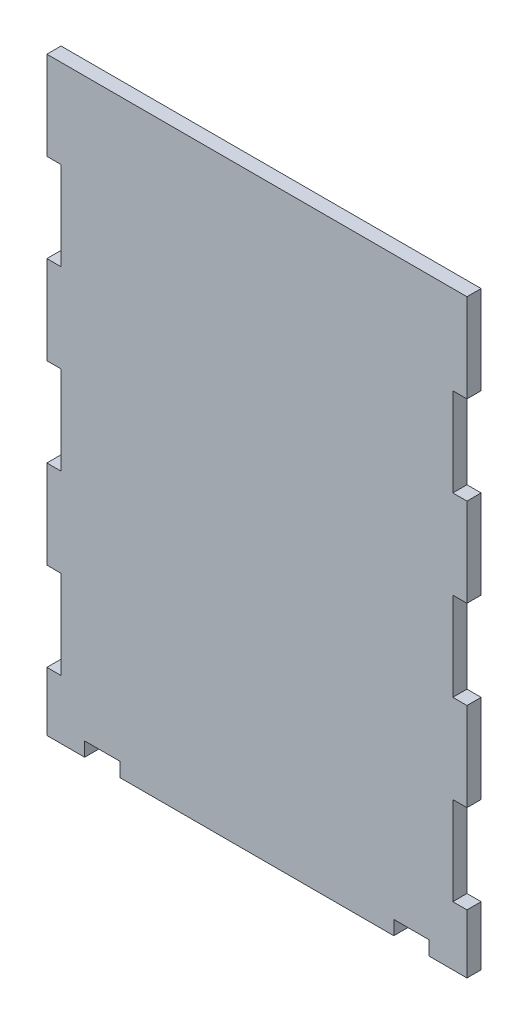
ISO-10303-21;
HEADER;
FILE_DESCRIPTION(('STEP AP214'),'2;1');
FILE_NAME('part.step','',(''),(''),'','','');
FILE_SCHEMA(('AUTOMOTIVE_DESIGN { 1 0 10303 214 1 1 1 1 }'));
ENDSEC;
DATA;
#1=APPLICATION_CONTEXT('core data for automotive mechanical design processes');
#2=APPLICATION_PROTOCOL_DEFINITION('international standard','automotive_design',2000,#1);
#3=PRODUCT_CONTEXT('',#1,'mechanical');
#4=PRODUCT('Part','Part','',(#3));
#5=PRODUCT_RELATED_PRODUCT_CATEGORY('part','',(#4));
#6=PRODUCT_DEFINITION_FORMATION('','',#4);
#7=PRODUCT_DEFINITION_CONTEXT('part definition',#1,'design');
#8=PRODUCT_DEFINITION('design','',#6,#7);
#9=PRODUCT_DEFINITION_SHAPE('','',#8);
#10=(LENGTH_UNIT() NAMED_UNIT(*) SI_UNIT(.MILLI.,.METRE.));
#11=(NAMED_UNIT(*) PLANE_ANGLE_UNIT() SI_UNIT($,.RADIAN.));
#12=(NAMED_UNIT(*) SI_UNIT($,.STERADIAN.) SOLID_ANGLE_UNIT());
#13=UNCERTAINTY_MEASURE_WITH_UNIT(LENGTH_MEASURE(1.E-05),#10,'distance_accuracy_value','');
#14=(GEOMETRIC_REPRESENTATION_CONTEXT(3) GLOBAL_UNCERTAINTY_ASSIGNED_CONTEXT((#13)) GLOBAL_UNIT_ASSIGNED_CONTEXT((#10,
#11,#12)) REPRESENTATION_CONTEXT('',''));
#15=CARTESIAN_POINT('',(0.,0.,0.));
#16=DIRECTION('',(0.,0.,1.));
#17=DIRECTION('',(1.,0.,0.));
#18=AXIS2_PLACEMENT_3D('',#15,#16,#17);
#19=CARTESIAN_POINT('',(0.,0.,6.));
#20=DIRECTION('',(0.,1.,0.));
#21=DIRECTION('',(-1.,0.,0.));
#22=AXIS2_PLACEMENT_3D('',#19,#20,#21);
#23=PLANE('',#22);
#24=DIRECTION('',(1.,0.,0.));
#25=VECTOR('',#24,1.);
#26=CARTESIAN_POINT('',(0.,0.,6.));
#27=LINE('',#26,#25);
#28=CARTESIAN_POINT('',(-16.,0.,6.));
#29=VERTEX_POINT('',#28);
#30=CARTESIAN_POINT('',(0.,0.,6.));
#31=VERTEX_POINT('',#30);
#32=EDGE_CURVE('E589',#29,#31,#27,.T.);
#33=ORIENTED_EDGE('',*,*,#32,.F.);
#34=DIRECTION('',(0.,0.,1.));
#35=VECTOR('',#34,1.);
#36=CARTESIAN_POINT('',(-16.,0.,0.));
#37=LINE('',#36,#35);
#38=CARTESIAN_POINT('',(-16.,0.,0.));
#39=VERTEX_POINT('',#38);
#40=EDGE_CURVE('E316',#39,#29,#37,.T.);
#41=ORIENTED_EDGE('',*,*,#40,.F.);
#42=DIRECTION('',(1.,0.,0.));
#43=VECTOR('',#42,1.);
#44=CARTESIAN_POINT('',(0.,0.,0.));
#45=LINE('',#44,#43);
#46=CARTESIAN_POINT('',(0.,0.,0.));
#47=VERTEX_POINT('',#46);
#48=EDGE_CURVE('E301',#39,#47,#45,.T.);
#49=ORIENTED_EDGE('',*,*,#48,.T.);
#50=DIRECTION('',(0.,0.,-1.));
#51=VECTOR('',#50,1.);
#52=CARTESIAN_POINT('',(0.,0.,6.));
#53=LINE('',#52,#51);
#54=EDGE_CURVE('E595',#31,#47,#53,.T.);
#55=ORIENTED_EDGE('',*,*,#54,.F.);
#56=EDGE_LOOP('',(#33,#41,#49,#55));
#57=FACE_BOUND('',#56,.T.);
#58=ADVANCED_FACE('F45',(#57),#23,.F.);
#59=CARTESIAN_POINT('',(-178.,0.,0.));
#60=VERTEX_POINT('',#59);
#61=CARTESIAN_POINT('',(-162.,0.,0.));
#62=VERTEX_POINT('',#61);
#63=EDGE_CURVE('E611',#60,#62,#45,.T.);
#64=ORIENTED_EDGE('',*,*,#63,.T.);
#65=DIRECTION('',(0.,0.,1.));
#66=VECTOR('',#65,1.);
#67=CARTESIAN_POINT('',(-162.,0.,0.));
#68=LINE('',#67,#66);
#69=CARTESIAN_POINT('',(-162.,0.,6.));
#70=VERTEX_POINT('',#69);
#71=EDGE_CURVE('E336',#62,#70,#68,.T.);
#72=ORIENTED_EDGE('',*,*,#71,.T.);
#73=CARTESIAN_POINT('',(-178.,0.,6.));
#74=VERTEX_POINT('',#73);
#75=EDGE_CURVE('E591',#74,#70,#27,.T.);
#76=ORIENTED_EDGE('',*,*,#75,.F.);
#77=DIRECTION('',(0.,0.,-1.));
#78=VECTOR('',#77,1.);
#79=CARTESIAN_POINT('',(-178.,0.,6.));
#80=LINE('',#79,#78);
#81=EDGE_CURVE('E619',#74,#60,#80,.T.);
#82=ORIENTED_EDGE('',*,*,#81,.T.);
#83=EDGE_LOOP('',(#64,#72,#76,#82));
#84=FACE_BOUND('',#83,.T.);
#85=ADVANCED_FACE('F696',(#84),#23,.F.);
#86=CARTESIAN_POINT('',(0.,0.,6.));
#87=DIRECTION('',(-1.,0.,0.));
#88=DIRECTION('',(0.,0.,1.));
#89=AXIS2_PLACEMENT_3D('',#86,#87,#88);
#90=PLANE('',#89);
#91=DIRECTION('',(0.,1.,0.));
#92=VECTOR('',#91,1.);
#93=CARTESIAN_POINT('',(0.,0.,6.));
#94=LINE('',#93,#92);
#95=CARTESIAN_POINT('',(0.,212.5,6.));
#96=VERTEX_POINT('',#95);
#97=CARTESIAN_POINT('',(0.,250.,6.));
#98=VERTEX_POINT('',#97);
#99=EDGE_CURVE('E581',#96,#98,#94,.T.);
#100=ORIENTED_EDGE('',*,*,#99,.F.);
#101=DIRECTION('',(0.,0.,1.));
#102=VECTOR('',#101,1.);
#103=CARTESIAN_POINT('',(0.,212.5,0.));
#104=LINE('',#103,#102);
#105=CARTESIAN_POINT('',(0.,212.5,0.));
#106=VERTEX_POINT('',#105);
#107=EDGE_CURVE('E388',#106,#96,#104,.T.);
#108=ORIENTED_EDGE('',*,*,#107,.F.);
#109=DIRECTION('',(0.,1.,0.));
#110=VECTOR('',#109,1.);
#111=CARTESIAN_POINT('',(0.,0.,0.));
#112=LINE('',#111,#110);
#113=CARTESIAN_POINT('',(0.,250.,0.));
#114=VERTEX_POINT('',#113);
#115=EDGE_CURVE('E566',#106,#114,#112,.T.);
#116=ORIENTED_EDGE('',*,*,#115,.T.);
#117=DIRECTION('',(0.,0.,-1.));
#118=VECTOR('',#117,1.);
#119=CARTESIAN_POINT('',(0.,250.,6.));
#120=LINE('',#119,#118);
#121=EDGE_CURVE('E11',#98,#114,#120,.T.);
#122=ORIENTED_EDGE('',*,*,#121,.F.);
#123=EDGE_LOOP('',(#100,#108,#116,#122));
#124=FACE_BOUND('',#123,.T.);
#125=ADVANCED_FACE('F645',(#124),#90,.F.);
#126=CARTESIAN_POINT('',(0.,137.5,0.));
#127=VERTEX_POINT('',#126);
#128=CARTESIAN_POINT('',(0.,175.,0.));
#129=VERTEX_POINT('',#128);
#130=EDGE_CURVE('E648',#127,#129,#112,.T.);
#131=ORIENTED_EDGE('',*,*,#130,.T.);
#132=DIRECTION('',(0.,0.,1.));
#133=VECTOR('',#132,1.);
#134=CARTESIAN_POINT('',(0.,175.,0.));
#135=LINE('',#134,#133);
#136=CARTESIAN_POINT('',(0.,175.,6.));
#137=VERTEX_POINT('',#136);
#138=EDGE_CURVE('E391',#129,#137,#135,.T.);
#139=ORIENTED_EDGE('',*,*,#138,.T.);
#140=CARTESIAN_POINT('',(0.,137.5,6.));
#141=VERTEX_POINT('',#140);
#142=EDGE_CURVE('E672',#141,#137,#94,.T.);
#143=ORIENTED_EDGE('',*,*,#142,.F.);
#144=DIRECTION('',(0.,0.,1.));
#145=VECTOR('',#144,1.);
#146=CARTESIAN_POINT('',(0.,137.5,0.));
#147=LINE('',#146,#145);
#148=EDGE_CURVE('E460',#127,#141,#147,.T.);
#149=ORIENTED_EDGE('',*,*,#148,.F.);
#150=EDGE_LOOP('',(#131,#139,#143,#149));
#151=FACE_BOUND('',#150,.T.);
#152=ADVANCED_FACE('F1032',(#151),#90,.F.);
#153=CARTESIAN_POINT('',(0.,62.5,0.));
#154=VERTEX_POINT('',#153);
#155=CARTESIAN_POINT('',(0.,100.,0.));
#156=VERTEX_POINT('',#155);
#157=EDGE_CURVE('E602',#154,#156,#112,.T.);
#158=ORIENTED_EDGE('',*,*,#157,.T.);
#159=DIRECTION('',(0.,0.,1.));
#160=VECTOR('',#159,1.);
#161=CARTESIAN_POINT('',(0.,100.,0.));
#162=LINE('',#161,#160);
#163=CARTESIAN_POINT('',(0.,100.,6.));
#164=VERTEX_POINT('',#163);
#165=EDGE_CURVE('E463',#156,#164,#162,.T.);
#166=ORIENTED_EDGE('',*,*,#165,.T.);
#167=CARTESIAN_POINT('',(0.,62.5,6.));
#168=VERTEX_POINT('',#167);
#169=EDGE_CURVE('E580',#168,#164,#94,.T.);
#170=ORIENTED_EDGE('',*,*,#169,.F.);
#171=DIRECTION('',(0.,0.,1.));
#172=VECTOR('',#171,1.);
#173=CARTESIAN_POINT('',(0.,62.5,0.));
#174=LINE('',#173,#172);
#175=EDGE_CURVE('E530',#154,#168,#174,.T.);
#176=ORIENTED_EDGE('',*,*,#175,.F.);
#177=EDGE_LOOP('',(#158,#166,#170,#176));
#178=FACE_BOUND('',#177,.T.);
#179=ADVANCED_FACE('F659',(#178),#90,.F.);
#180=CARTESIAN_POINT('',(-178.,0.,6.));
#181=DIRECTION('',(1.,0.,0.));
#182=DIRECTION('',(0.,0.,-1.));
#183=AXIS2_PLACEMENT_3D('',#180,#181,#182);
#184=PLANE('',#183);
#185=DIRECTION('',(0.,-1.,0.));
#186=VECTOR('',#185,1.);
#187=CARTESIAN_POINT('',(-178.,0.,0.));
#188=LINE('',#187,#186);
#189=CARTESIAN_POINT('',(-178.,175.,0.));
#190=VERTEX_POINT('',#189);
#191=CARTESIAN_POINT('',(-178.,137.5,0.));
#192=VERTEX_POINT('',#191);
#193=EDGE_CURVE('E610',#190,#192,#188,.T.);
#194=ORIENTED_EDGE('',*,*,#193,.T.);
#195=DIRECTION('',(0.,0.,1.));
#196=VECTOR('',#195,1.);
#197=CARTESIAN_POINT('',(-178.,137.5,0.));
#198=LINE('',#197,#196);
#199=CARTESIAN_POINT('',(-178.,137.5,6.));
#200=VERTEX_POINT('',#199);
#201=EDGE_CURVE('E378',#192,#200,#198,.T.);
#202=ORIENTED_EDGE('',*,*,#201,.T.);
#203=DIRECTION('',(0.,-1.,0.));
#204=VECTOR('',#203,1.);
#205=CARTESIAN_POINT('',(-178.,0.,6.));
#206=LINE('',#205,#204);
#207=CARTESIAN_POINT('',(-178.,175.,6.));
#208=VERTEX_POINT('',#207);
#209=EDGE_CURVE('E590',#208,#200,#206,.T.);
#210=ORIENTED_EDGE('',*,*,#209,.F.);
#211=DIRECTION('',(0.,0.,1.));
#212=VECTOR('',#211,1.);
#213=CARTESIAN_POINT('',(-178.,175.,0.));
#214=LINE('',#213,#212);
#215=EDGE_CURVE('E552',#190,#208,#214,.T.);
#216=ORIENTED_EDGE('',*,*,#215,.F.);
#217=EDGE_LOOP('',(#194,#202,#210,#216));
#218=FACE_BOUND('',#217,.T.);
#219=ADVANCED_FACE('F719',(#218),#184,.F.);
#220=CARTESIAN_POINT('',(-178.,100.,6.));
#221=VERTEX_POINT('',#220);
#222=CARTESIAN_POINT('',(-178.,62.5,6.));
#223=VERTEX_POINT('',#222);
#224=EDGE_CURVE('E705',#221,#223,#206,.T.);
#225=ORIENTED_EDGE('',*,*,#224,.F.);
#226=DIRECTION('',(0.,0.,1.));
#227=VECTOR('',#226,1.);
#228=CARTESIAN_POINT('',(-178.,100.,0.));
#229=LINE('',#228,#227);
#230=CARTESIAN_POINT('',(-178.,100.,0.));
#231=VERTEX_POINT('',#230);
#232=EDGE_CURVE('E410',#231,#221,#229,.T.);
#233=ORIENTED_EDGE('',*,*,#232,.F.);
#234=CARTESIAN_POINT('',(-178.,62.5,0.));
#235=VERTEX_POINT('',#234);
#236=EDGE_CURVE('E684',#231,#235,#188,.T.);
#237=ORIENTED_EDGE('',*,*,#236,.T.);
#238=DIRECTION('',(0.,0.,1.));
#239=VECTOR('',#238,1.);
#240=CARTESIAN_POINT('',(-178.,62.5,0.));
#241=LINE('',#240,#239);
#242=EDGE_CURVE('E452',#235,#223,#241,.T.);
#243=ORIENTED_EDGE('',*,*,#242,.T.);
#244=EDGE_LOOP('',(#225,#233,#237,#243));
#245=FACE_BOUND('',#244,.T.);
#246=ADVANCED_FACE('F732',(#245),#184,.F.);
#247=CARTESIAN_POINT('',(-178.,250.,0.));
#248=VERTEX_POINT('',#247);
#249=CARTESIAN_POINT('',(-178.,212.5,0.));
#250=VERTEX_POINT('',#249);
#251=EDGE_CURVE('E606',#248,#250,#188,.T.);
#252=ORIENTED_EDGE('',*,*,#251,.T.);
#253=DIRECTION('',(0.,0.,1.));
#254=VECTOR('',#253,1.);
#255=CARTESIAN_POINT('',(-178.,212.5,0.));
#256=LINE('',#255,#254);
#257=CARTESIAN_POINT('',(-178.,212.5,6.));
#258=VERTEX_POINT('',#257);
#259=EDGE_CURVE('E562',#250,#258,#256,.T.);
#260=ORIENTED_EDGE('',*,*,#259,.T.);
#261=CARTESIAN_POINT('',(-178.,250.,6.));
#262=VERTEX_POINT('',#261);
#263=EDGE_CURVE('E585',#262,#258,#206,.T.);
#264=ORIENTED_EDGE('',*,*,#263,.F.);
#265=DIRECTION('',(0.,0.,-1.));
#266=VECTOR('',#265,1.);
#267=CARTESIAN_POINT('',(-178.,250.,6.));
#268=LINE('',#267,#266);
#269=EDGE_CURVE('E54',#262,#248,#268,.T.);
#270=ORIENTED_EDGE('',*,*,#269,.T.);
#271=EDGE_LOOP('',(#252,#260,#264,#270));
#272=FACE_BOUND('',#271,.T.);
#273=ADVANCED_FACE('F628',(#272),#184,.F.);
#274=CARTESIAN_POINT('',(0.,25.,0.));
#275=VERTEX_POINT('',#274);
#276=EDGE_CURVE('E597',#47,#275,#112,.T.);
#277=ORIENTED_EDGE('',*,*,#276,.T.);
#278=DIRECTION('',(0.,0.,1.));
#279=VECTOR('',#278,1.);
#280=CARTESIAN_POINT('',(0.,25.,0.));
#281=LINE('',#280,#279);
#282=CARTESIAN_POINT('',(0.,25.,6.));
#283=VERTEX_POINT('',#282);
#284=EDGE_CURVE('E533',#275,#283,#281,.T.);
#285=ORIENTED_EDGE('',*,*,#284,.T.);
#286=EDGE_CURVE('E575',#31,#283,#94,.T.);
#287=ORIENTED_EDGE('',*,*,#286,.F.);
#288=ORIENTED_EDGE('',*,*,#54,.T.);
#289=EDGE_LOOP('',(#277,#285,#287,#288));
#290=FACE_BOUND('',#289,.T.);
#291=ADVANCED_FACE('F47',(#290),#90,.F.);
#292=CARTESIAN_POINT('',(0.,250.,6.));
#293=DIRECTION('',(0.,-1.,0.));
#294=DIRECTION('',(1.,0.,0.));
#295=AXIS2_PLACEMENT_3D('',#292,#293,#294);
#296=PLANE('',#295);
#297=DIRECTION('',(-1.,0.,0.));
#298=VECTOR('',#297,1.);
#299=CARTESIAN_POINT('',(0.,250.,0.));
#300=LINE('',#299,#298);
#301=EDGE_CURVE('E601',#114,#248,#300,.T.);
#302=ORIENTED_EDGE('',*,*,#301,.T.);
#303=ORIENTED_EDGE('',*,*,#269,.F.);
#304=DIRECTION('',(-1.,0.,0.));
#305=VECTOR('',#304,1.);
#306=CARTESIAN_POINT('',(0.,250.,6.));
#307=LINE('',#306,#305);
#308=EDGE_CURVE('E579',#98,#262,#307,.T.);
#309=ORIENTED_EDGE('',*,*,#308,.F.);
#310=ORIENTED_EDGE('',*,*,#121,.T.);
#311=EDGE_LOOP('',(#302,#303,#309,#310));
#312=FACE_BOUND('',#311,.T.);
#313=ADVANCED_FACE('F643',(#312),#296,.F.);
#314=CARTESIAN_POINT('',(-178.,25.,6.));
#315=VERTEX_POINT('',#314);
#316=EDGE_CURVE('E584',#315,#74,#206,.T.);
#317=ORIENTED_EDGE('',*,*,#316,.F.);
#318=DIRECTION('',(0.,0.,1.));
#319=VECTOR('',#318,1.);
#320=CARTESIAN_POINT('',(-178.,25.,0.));
#321=LINE('',#320,#319);
#322=CARTESIAN_POINT('',(-178.,25.,0.));
#323=VERTEX_POINT('',#322);
#324=EDGE_CURVE('E482',#323,#315,#321,.T.);
#325=ORIENTED_EDGE('',*,*,#324,.F.);
#326=EDGE_CURVE('E605',#323,#60,#188,.T.);
#327=ORIENTED_EDGE('',*,*,#326,.T.);
#328=ORIENTED_EDGE('',*,*,#81,.F.);
#329=EDGE_LOOP('',(#317,#325,#327,#328));
#330=FACE_BOUND('',#329,.T.);
#331=ADVANCED_FACE('F692',(#330),#184,.F.);
#332=CARTESIAN_POINT('',(-147.,0.,0.));
#333=VERTEX_POINT('',#332);
#334=CARTESIAN_POINT('',(-31.,0.,0.));
#335=VERTEX_POINT('',#334);
#336=EDGE_CURVE('E615',#333,#335,#45,.T.);
#337=ORIENTED_EDGE('',*,*,#336,.T.);
#338=DIRECTION('',(0.,0.,1.));
#339=VECTOR('',#338,1.);
#340=CARTESIAN_POINT('',(-31.,0.,0.));
#341=LINE('',#340,#339);
#342=CARTESIAN_POINT('',(-31.,0.,6.));
#343=VERTEX_POINT('',#342);
#344=EDGE_CURVE('E320',#335,#343,#341,.T.);
#345=ORIENTED_EDGE('',*,*,#344,.T.);
#346=CARTESIAN_POINT('',(-147.,0.,6.));
#347=VERTEX_POINT('',#346);
#348=EDGE_CURVE('E596',#347,#343,#27,.T.);
#349=ORIENTED_EDGE('',*,*,#348,.F.);
#350=DIRECTION('',(0.,0.,1.));
#351=VECTOR('',#350,1.);
#352=CARTESIAN_POINT('',(-147.,0.,0.));
#353=LINE('',#352,#351);
#354=EDGE_CURVE('E326',#333,#347,#353,.T.);
#355=ORIENTED_EDGE('',*,*,#354,.F.);
#356=EDGE_LOOP('',(#337,#345,#349,#355));
#357=FACE_BOUND('',#356,.T.);
#358=ADVANCED_FACE('F756',(#357),#23,.F.);
#359=CARTESIAN_POINT('',(0.,0.,6.));
#360=DIRECTION('',(0.,0.,1.));
#361=DIRECTION('',(1.,0.,0.));
#362=AXIS2_PLACEMENT_3D('',#359,#360,#361);
#363=PLANE('',#362);
#364=DIRECTION('',(0.,1.,0.));
#365=VECTOR('',#364,1.);
#366=CARTESIAN_POINT('',(-16.,0.,6.));
#367=LINE('',#366,#365);
#368=CARTESIAN_POINT('',(-16.,6.,6.));
#369=VERTEX_POINT('',#368);
#370=EDGE_CURVE('E285',#29,#369,#367,.T.);
#371=ORIENTED_EDGE('',*,*,#370,.F.);
#372=ORIENTED_EDGE('',*,*,#32,.T.);
#373=ORIENTED_EDGE('',*,*,#286,.T.);
#374=DIRECTION('',(1.,0.,0.));
#375=VECTOR('',#374,1.);
#376=CARTESIAN_POINT('',(-6.00000000000001,25.,6.));
#377=LINE('',#376,#375);
#378=CARTESIAN_POINT('',(-6.00000000000001,25.,6.));
#379=VERTEX_POINT('',#378);
#380=EDGE_CURVE('E522',#379,#283,#377,.T.);
#381=ORIENTED_EDGE('',*,*,#380,.F.);
#382=DIRECTION('',(0.,-1.,0.));
#383=VECTOR('',#382,1.);
#384=CARTESIAN_POINT('',(-6.00000000000001,62.5,6.));
#385=LINE('',#384,#383);
#386=CARTESIAN_POINT('',(-6.00000000000001,62.5,6.));
#387=VERTEX_POINT('',#386);
#388=EDGE_CURVE('E319',#387,#379,#385,.T.);
#389=ORIENTED_EDGE('',*,*,#388,.F.);
#390=DIRECTION('',(-1.,0.,0.));
#391=VECTOR('',#390,1.);
#392=CARTESIAN_POINT('',(-6.00000000000001,62.5,6.));
#393=LINE('',#392,#391);
#394=EDGE_CURVE('E510',#168,#387,#393,.T.);
#395=ORIENTED_EDGE('',*,*,#394,.F.);
#396=ORIENTED_EDGE('',*,*,#169,.T.);
#397=DIRECTION('',(1.,0.,0.));
#398=VECTOR('',#397,1.);
#399=CARTESIAN_POINT('',(-6.00000000000001,100.,6.));
#400=LINE('',#399,#398);
#401=CARTESIAN_POINT('',(-6.00000000000001,100.,6.));
#402=VERTEX_POINT('',#401);
#403=EDGE_CURVE('E451',#402,#164,#400,.T.);
#404=ORIENTED_EDGE('',*,*,#403,.F.);
#405=DIRECTION('',(0.,-1.,0.));
#406=VECTOR('',#405,1.);
#407=CARTESIAN_POINT('',(-6.00000000000001,137.5,6.));
#408=LINE('',#407,#406);
#409=CARTESIAN_POINT('',(-6.00000000000001,137.5,6.));
#410=VERTEX_POINT('',#409);
#411=EDGE_CURVE('E447',#410,#402,#408,.T.);
#412=ORIENTED_EDGE('',*,*,#411,.F.);
#413=DIRECTION('',(-1.,0.,0.));
#414=VECTOR('',#413,1.);
#415=CARTESIAN_POINT('',(-6.00000000000001,137.5,6.));
#416=LINE('',#415,#414);
#417=EDGE_CURVE('E438',#141,#410,#416,.T.);
#418=ORIENTED_EDGE('',*,*,#417,.F.);
#419=ORIENTED_EDGE('',*,*,#142,.T.);
#420=DIRECTION('',(1.,0.,0.));
#421=VECTOR('',#420,1.);
#422=CARTESIAN_POINT('',(-6.00000000000001,175.,6.));
#423=LINE('',#422,#421);
#424=CARTESIAN_POINT('',(-6.00000000000001,175.,6.));
#425=VERTEX_POINT('',#424);
#426=EDGE_CURVE('E377',#425,#137,#423,.T.);
#427=ORIENTED_EDGE('',*,*,#426,.F.);
#428=DIRECTION('',(0.,-1.,0.));
#429=VECTOR('',#428,1.);
#430=CARTESIAN_POINT('',(-6.00000000000001,212.5,6.));
#431=LINE('',#430,#429);
#432=CARTESIAN_POINT('',(-6.00000000000001,212.5,6.));
#433=VERTEX_POINT('',#432);
#434=EDGE_CURVE('E373',#433,#425,#431,.T.);
#435=ORIENTED_EDGE('',*,*,#434,.F.);
#436=DIRECTION('',(-1.,0.,0.));
#437=VECTOR('',#436,1.);
#438=CARTESIAN_POINT('',(-6.00000000000001,212.5,6.));
#439=LINE('',#438,#437);
#440=EDGE_CURVE('E364',#96,#433,#439,.T.);
#441=ORIENTED_EDGE('',*,*,#440,.F.);
#442=ORIENTED_EDGE('',*,*,#99,.T.);
#443=ORIENTED_EDGE('',*,*,#308,.T.);
#444=ORIENTED_EDGE('',*,*,#263,.T.);
#445=DIRECTION('',(-1.,0.,0.));
#446=VECTOR('',#445,1.);
#447=CARTESIAN_POINT('',(-178.,212.5,6.));
#448=LINE('',#447,#446);
#449=CARTESIAN_POINT('',(-172.,212.5,6.));
#450=VERTEX_POINT('',#449);
#451=EDGE_CURVE('E544',#450,#258,#448,.T.);
#452=ORIENTED_EDGE('',*,*,#451,.F.);
#453=DIRECTION('',(0.,1.,0.));
#454=VECTOR('',#453,1.);
#455=CARTESIAN_POINT('',(-172.,212.5,6.));
#456=LINE('',#455,#454);
#457=CARTESIAN_POINT('',(-172.,175.,6.));
#458=VERTEX_POINT('',#457);
#459=EDGE_CURVE('E556',#458,#450,#456,.T.);
#460=ORIENTED_EDGE('',*,*,#459,.F.);
#461=DIRECTION('',(1.,0.,0.));
#462=VECTOR('',#461,1.);
#463=CARTESIAN_POINT('',(-178.,175.,6.));
#464=LINE('',#463,#462);
#465=EDGE_CURVE('E387',#208,#458,#464,.T.);
#466=ORIENTED_EDGE('',*,*,#465,.F.);
#467=ORIENTED_EDGE('',*,*,#209,.T.);
#468=DIRECTION('',(-1.,0.,0.));
#469=VECTOR('',#468,1.);
#470=CARTESIAN_POINT('',(-178.,137.5,6.));
#471=LINE('',#470,#469);
#472=CARTESIAN_POINT('',(-172.,137.5,6.));
#473=VERTEX_POINT('',#472);
#474=EDGE_CURVE('E402',#473,#200,#471,.T.);
#475=ORIENTED_EDGE('',*,*,#474,.F.);
#476=DIRECTION('',(0.,1.,0.));
#477=VECTOR('',#476,1.);
#478=CARTESIAN_POINT('',(-172.,137.5,6.));
#479=LINE('',#478,#477);
#480=CARTESIAN_POINT('',(-172.,100.,6.));
#481=VERTEX_POINT('',#480);
#482=EDGE_CURVE('E415',#481,#473,#479,.T.);
#483=ORIENTED_EDGE('',*,*,#482,.F.);
#484=DIRECTION('',(1.,0.,0.));
#485=VECTOR('',#484,1.);
#486=CARTESIAN_POINT('',(-178.,100.,6.));
#487=LINE('',#486,#485);
#488=EDGE_CURVE('E411',#221,#481,#487,.T.);
#489=ORIENTED_EDGE('',*,*,#488,.F.);
#490=ORIENTED_EDGE('',*,*,#224,.T.);
#491=DIRECTION('',(-1.,0.,0.));
#492=VECTOR('',#491,1.);
#493=CARTESIAN_POINT('',(-178.,62.5,6.));
#494=LINE('',#493,#492);
#495=CARTESIAN_POINT('',(-172.,62.5,6.));
#496=VERTEX_POINT('',#495);
#497=EDGE_CURVE('E474',#496,#223,#494,.T.);
#498=ORIENTED_EDGE('',*,*,#497,.F.);
#499=DIRECTION('',(0.,1.,0.));
#500=VECTOR('',#499,1.);
#501=CARTESIAN_POINT('',(-172.,62.5,6.));
#502=LINE('',#501,#500);
#503=CARTESIAN_POINT('',(-172.,25.,6.));
#504=VERTEX_POINT('',#503);
#505=EDGE_CURVE('E487',#504,#496,#502,.T.);
#506=ORIENTED_EDGE('',*,*,#505,.F.);
#507=DIRECTION('',(1.,0.,0.));
#508=VECTOR('',#507,1.);
#509=CARTESIAN_POINT('',(-178.,25.,6.));
#510=LINE('',#509,#508);
#511=EDGE_CURVE('E483',#315,#504,#510,.T.);
#512=ORIENTED_EDGE('',*,*,#511,.F.);
#513=ORIENTED_EDGE('',*,*,#316,.T.);
#514=ORIENTED_EDGE('',*,*,#75,.T.);
#515=DIRECTION('',(0.,-1.,0.));
#516=VECTOR('',#515,1.);
#517=CARTESIAN_POINT('',(-162.,0.,6.));
#518=LINE('',#517,#516);
#519=CARTESIAN_POINT('',(-162.,6.,6.));
#520=VERTEX_POINT('',#519);
#521=EDGE_CURVE('E340',#520,#70,#518,.T.);
#522=ORIENTED_EDGE('',*,*,#521,.F.);
#523=DIRECTION('',(-1.,0.,0.));
#524=VECTOR('',#523,1.);
#525=CARTESIAN_POINT('',(-162.,6.,6.));
#526=LINE('',#525,#524);
#527=CARTESIAN_POINT('',(-147.,5.99999999999998,6.));
#528=VERTEX_POINT('',#527);
#529=EDGE_CURVE('E343',#528,#520,#526,.T.);
#530=ORIENTED_EDGE('',*,*,#529,.F.);
#531=DIRECTION('',(0.,1.,0.));
#532=VECTOR('',#531,1.);
#533=CARTESIAN_POINT('',(-147.,0.,6.));
#534=LINE('',#533,#532);
#535=EDGE_CURVE('E313',#347,#528,#534,.T.);
#536=ORIENTED_EDGE('',*,*,#535,.F.);
#537=ORIENTED_EDGE('',*,*,#348,.T.);
#538=DIRECTION('',(0.,-1.,0.));
#539=VECTOR('',#538,1.);
#540=CARTESIAN_POINT('',(-31.,0.,6.));
#541=LINE('',#540,#539);
#542=CARTESIAN_POINT('',(-31.,6.,6.));
#543=VERTEX_POINT('',#542);
#544=EDGE_CURVE('E303',#543,#343,#541,.T.);
#545=ORIENTED_EDGE('',*,*,#544,.F.);
#546=DIRECTION('',(-1.,0.,0.));
#547=VECTOR('',#546,1.);
#548=CARTESIAN_POINT('',(-16.,6.,6.));
#549=LINE('',#548,#547);
#550=EDGE_CURVE('E306',#369,#543,#549,.T.);
#551=ORIENTED_EDGE('',*,*,#550,.F.);
#552=EDGE_LOOP('',(#371,#372,#373,#381,#389,#395,#396,#404,#412,#418,#419,#427,#435,#441,#442,
#443,#444,#452,#460,#466,#467,#475,#483,#489,#490,#498,#506,#512,#513,#514,#522,#530,#536,#537,
#545,#551));
#553=FACE_BOUND('',#552,.T.);
#554=ADVANCED_FACE('F638',(#553),#363,.T.);
#555=CARTESIAN_POINT('',(0.,0.,0.));
#556=DIRECTION('',(0.,0.,1.));
#557=DIRECTION('',(1.,0.,0.));
#558=AXIS2_PLACEMENT_3D('',#555,#556,#557);
#559=PLANE('',#558);
#560=ORIENTED_EDGE('',*,*,#48,.F.);
#561=DIRECTION('',(0.,1.,0.));
#562=VECTOR('',#561,1.);
#563=CARTESIAN_POINT('',(-16.,0.,0.));
#564=LINE('',#563,#562);
#565=CARTESIAN_POINT('',(-16.,6.,0.));
#566=VERTEX_POINT('',#565);
#567=EDGE_CURVE('E282',#39,#566,#564,.T.);
#568=ORIENTED_EDGE('',*,*,#567,.T.);
#569=DIRECTION('',(-1.,0.,0.));
#570=VECTOR('',#569,1.);
#571=CARTESIAN_POINT('',(-16.,6.,0.));
#572=LINE('',#571,#570);
#573=CARTESIAN_POINT('',(-31.,6.,0.));
#574=VERTEX_POINT('',#573);
#575=EDGE_CURVE('E293',#566,#574,#572,.T.);
#576=ORIENTED_EDGE('',*,*,#575,.T.);
#577=DIRECTION('',(0.,-1.,0.));
#578=VECTOR('',#577,1.);
#579=CARTESIAN_POINT('',(-31.,0.,0.));
#580=LINE('',#579,#578);
#581=EDGE_CURVE('E61',#574,#335,#580,.T.);
#582=ORIENTED_EDGE('',*,*,#581,.T.);
#583=ORIENTED_EDGE('',*,*,#336,.F.);
#584=DIRECTION('',(0.,1.,0.));
#585=VECTOR('',#584,1.);
#586=CARTESIAN_POINT('',(-147.,0.,0.));
#587=LINE('',#586,#585);
#588=CARTESIAN_POINT('',(-147.,5.99999999999998,0.));
#589=VERTEX_POINT('',#588);
#590=EDGE_CURVE('E344',#333,#589,#587,.T.);
#591=ORIENTED_EDGE('',*,*,#590,.T.);
#592=DIRECTION('',(-1.,0.,0.));
#593=VECTOR('',#592,1.);
#594=CARTESIAN_POINT('',(-162.,6.,0.));
#595=LINE('',#594,#593);
#596=CARTESIAN_POINT('',(-162.,6.,0.));
#597=VERTEX_POINT('',#596);
#598=EDGE_CURVE('E69',#589,#597,#595,.T.);
#599=ORIENTED_EDGE('',*,*,#598,.T.);
#600=DIRECTION('',(0.,-1.,0.));
#601=VECTOR('',#600,1.);
#602=CARTESIAN_POINT('',(-162.,0.,0.));
#603=LINE('',#602,#601);
#604=EDGE_CURVE('E329',#597,#62,#603,.T.);
#605=ORIENTED_EDGE('',*,*,#604,.T.);
#606=ORIENTED_EDGE('',*,*,#63,.F.);
#607=ORIENTED_EDGE('',*,*,#326,.F.);
#608=DIRECTION('',(1.,0.,0.));
#609=VECTOR('',#608,1.);
#610=CARTESIAN_POINT('',(-178.,25.,0.));
#611=LINE('',#610,#609);
#612=CARTESIAN_POINT('',(-172.,25.,0.));
#613=VERTEX_POINT('',#612);
#614=EDGE_CURVE('E469',#323,#613,#611,.T.);
#615=ORIENTED_EDGE('',*,*,#614,.T.);
#616=DIRECTION('',(0.,1.,0.));
#617=VECTOR('',#616,1.);
#618=CARTESIAN_POINT('',(-172.,62.5,0.));
#619=LINE('',#618,#617);
#620=CARTESIAN_POINT('',(-172.,62.5,0.));
#621=VERTEX_POINT('',#620);
#622=EDGE_CURVE('E473',#613,#621,#619,.T.);
#623=ORIENTED_EDGE('',*,*,#622,.T.);
#624=DIRECTION('',(-1.,0.,0.));
#625=VECTOR('',#624,1.);
#626=CARTESIAN_POINT('',(-178.,62.5,0.));
#627=LINE('',#626,#625);
#628=EDGE_CURVE('E478',#621,#235,#627,.T.);
#629=ORIENTED_EDGE('',*,*,#628,.T.);
#630=ORIENTED_EDGE('',*,*,#236,.F.);
#631=DIRECTION('',(1.,0.,0.));
#632=VECTOR('',#631,1.);
#633=CARTESIAN_POINT('',(-178.,100.,0.));
#634=LINE('',#633,#632);
#635=CARTESIAN_POINT('',(-172.,100.,0.));
#636=VERTEX_POINT('',#635);
#637=EDGE_CURVE('E397',#231,#636,#634,.T.);
#638=ORIENTED_EDGE('',*,*,#637,.T.);
#639=DIRECTION('',(0.,1.,0.));
#640=VECTOR('',#639,1.);
#641=CARTESIAN_POINT('',(-172.,137.5,0.));
#642=LINE('',#641,#640);
#643=CARTESIAN_POINT('',(-172.,137.5,0.));
#644=VERTEX_POINT('',#643);
#645=EDGE_CURVE('E401',#636,#644,#642,.T.);
#646=ORIENTED_EDGE('',*,*,#645,.T.);
#647=DIRECTION('',(-1.,0.,0.));
#648=VECTOR('',#647,1.);
#649=CARTESIAN_POINT('',(-178.,137.5,0.));
#650=LINE('',#649,#648);
#651=EDGE_CURVE('E406',#644,#192,#650,.T.);
#652=ORIENTED_EDGE('',*,*,#651,.T.);
#653=ORIENTED_EDGE('',*,*,#193,.F.);
#654=DIRECTION('',(1.,0.,0.));
#655=VECTOR('',#654,1.);
#656=CARTESIAN_POINT('',(-178.,175.,0.));
#657=LINE('',#656,#655);
#658=CARTESIAN_POINT('',(-172.,175.,0.));
#659=VERTEX_POINT('',#658);
#660=EDGE_CURVE('E539',#190,#659,#657,.T.);
#661=ORIENTED_EDGE('',*,*,#660,.T.);
#662=DIRECTION('',(0.,1.,0.));
#663=VECTOR('',#662,1.);
#664=CARTESIAN_POINT('',(-172.,212.5,0.));
#665=LINE('',#664,#663);
#666=CARTESIAN_POINT('',(-172.,212.5,0.));
#667=VERTEX_POINT('',#666);
#668=EDGE_CURVE('E543',#659,#667,#665,.T.);
#669=ORIENTED_EDGE('',*,*,#668,.T.);
#670=DIRECTION('',(-1.,0.,0.));
#671=VECTOR('',#670,1.);
#672=CARTESIAN_POINT('',(-178.,212.5,0.));
#673=LINE('',#672,#671);
#674=EDGE_CURVE('E548',#667,#250,#673,.T.);
#675=ORIENTED_EDGE('',*,*,#674,.T.);
#676=ORIENTED_EDGE('',*,*,#251,.F.);
#677=ORIENTED_EDGE('',*,*,#301,.F.);
#678=ORIENTED_EDGE('',*,*,#115,.F.);
#679=DIRECTION('',(-1.,0.,0.));
#680=VECTOR('',#679,1.);
#681=CARTESIAN_POINT('',(-6.00000000000001,212.5,0.));
#682=LINE('',#681,#680);
#683=CARTESIAN_POINT('',(-6.00000000000001,212.5,0.));
#684=VERTEX_POINT('',#683);
#685=EDGE_CURVE('E368',#106,#684,#682,.T.);
#686=ORIENTED_EDGE('',*,*,#685,.T.);
#687=DIRECTION('',(0.,-1.,0.));
#688=VECTOR('',#687,1.);
#689=CARTESIAN_POINT('',(-6.00000000000001,212.5,0.));
#690=LINE('',#689,#688);
#691=CARTESIAN_POINT('',(-6.00000000000001,175.,0.));
#692=VERTEX_POINT('',#691);
#693=EDGE_CURVE('E359',#684,#692,#690,.T.);
#694=ORIENTED_EDGE('',*,*,#693,.T.);
#695=DIRECTION('',(1.,0.,0.));
#696=VECTOR('',#695,1.);
#697=CARTESIAN_POINT('',(-6.00000000000001,175.,0.));
#698=LINE('',#697,#696);
#699=EDGE_CURVE('E363',#692,#129,#698,.T.);
#700=ORIENTED_EDGE('',*,*,#699,.T.);
#701=ORIENTED_EDGE('',*,*,#130,.F.);
#702=DIRECTION('',(-1.,0.,0.));
#703=VECTOR('',#702,1.);
#704=CARTESIAN_POINT('',(-6.00000000000001,137.5,0.));
#705=LINE('',#704,#703);
#706=CARTESIAN_POINT('',(-6.00000000000001,137.5,0.));
#707=VERTEX_POINT('',#706);
#708=EDGE_CURVE('E442',#127,#707,#705,.T.);
#709=ORIENTED_EDGE('',*,*,#708,.T.);
#710=DIRECTION('',(0.,-1.,0.));
#711=VECTOR('',#710,1.);
#712=CARTESIAN_POINT('',(-6.00000000000001,137.5,0.));
#713=LINE('',#712,#711);
#714=CARTESIAN_POINT('',(-6.00000000000001,100.,0.));
#715=VERTEX_POINT('',#714);
#716=EDGE_CURVE('E433',#707,#715,#713,.T.);
#717=ORIENTED_EDGE('',*,*,#716,.T.);
#718=DIRECTION('',(1.,0.,0.));
#719=VECTOR('',#718,1.);
#720=CARTESIAN_POINT('',(-6.00000000000001,100.,0.));
#721=LINE('',#720,#719);
#722=EDGE_CURVE('E437',#715,#156,#721,.T.);
#723=ORIENTED_EDGE('',*,*,#722,.T.);
#724=ORIENTED_EDGE('',*,*,#157,.F.);
#725=DIRECTION('',(-1.,0.,0.));
#726=VECTOR('',#725,1.);
#727=CARTESIAN_POINT('',(-6.00000000000001,62.5,0.));
#728=LINE('',#727,#726);
#729=CARTESIAN_POINT('',(-6.00000000000001,62.5,0.));
#730=VERTEX_POINT('',#729);
#731=EDGE_CURVE('E514',#154,#730,#728,.T.);
#732=ORIENTED_EDGE('',*,*,#731,.T.);
#733=DIRECTION('',(0.,-1.,0.));
#734=VECTOR('',#733,1.);
#735=CARTESIAN_POINT('',(-6.00000000000001,62.5,0.));
#736=LINE('',#735,#734);
#737=CARTESIAN_POINT('',(-6.00000000000001,25.,0.));
#738=VERTEX_POINT('',#737);
#739=EDGE_CURVE('E505',#730,#738,#736,.T.);
#740=ORIENTED_EDGE('',*,*,#739,.T.);
#741=DIRECTION('',(1.,0.,0.));
#742=VECTOR('',#741,1.);
#743=CARTESIAN_POINT('',(-6.00000000000001,25.,0.));
#744=LINE('',#743,#742);
#745=EDGE_CURVE('E509',#738,#275,#744,.T.);
#746=ORIENTED_EDGE('',*,*,#745,.T.);
#747=ORIENTED_EDGE('',*,*,#276,.F.);
#748=EDGE_LOOP('',(#560,#568,#576,#582,#583,#591,#599,#605,#606,#607,#615,#623,#629,#630,#638,
#646,#652,#653,#661,#669,#675,#676,#677,#678,#686,#694,#700,#701,#709,#717,#723,#724,#732,#740,
#746,#747));
#749=FACE_BOUND('',#748,.T.);
#750=ADVANCED_FACE('F299',(#749),#559,.F.);
#751=CARTESIAN_POINT('',(-178.,212.5,0.));
#752=DIRECTION('',(0.,1.,0.));
#753=DIRECTION('',(0.,0.,1.));
#754=AXIS2_PLACEMENT_3D('',#751,#752,#753);
#755=PLANE('',#754);
#756=ORIENTED_EDGE('',*,*,#451,.T.);
#757=ORIENTED_EDGE('',*,*,#259,.F.);
#758=ORIENTED_EDGE('',*,*,#674,.F.);
#759=DIRECTION('',(0.,0.,1.));
#760=VECTOR('',#759,1.);
#761=CARTESIAN_POINT('',(-172.,212.5,0.));
#762=LINE('',#761,#760);
#763=EDGE_CURVE('E567',#667,#450,#762,.T.);
#764=ORIENTED_EDGE('',*,*,#763,.T.);
#765=EDGE_LOOP('',(#756,#757,#758,#764));
#766=FACE_BOUND('',#765,.T.);
#767=ADVANCED_FACE('F635',(#766),#755,.F.);
#768=CARTESIAN_POINT('',(-172.,212.5,0.));
#769=DIRECTION('',(1.,0.,0.));
#770=DIRECTION('',(0.,0.,-1.));
#771=AXIS2_PLACEMENT_3D('',#768,#769,#770);
#772=PLANE('',#771);
#773=ORIENTED_EDGE('',*,*,#459,.T.);
#774=ORIENTED_EDGE('',*,*,#763,.F.);
#775=ORIENTED_EDGE('',*,*,#668,.F.);
#776=DIRECTION('',(0.,0.,1.));
#777=VECTOR('',#776,1.);
#778=CARTESIAN_POINT('',(-172.,175.,0.));
#779=LINE('',#778,#777);
#780=EDGE_CURVE('E570',#659,#458,#779,.T.);
#781=ORIENTED_EDGE('',*,*,#780,.T.);
#782=EDGE_LOOP('',(#773,#774,#775,#781));
#783=FACE_BOUND('',#782,.T.);
#784=ADVANCED_FACE('F804',(#783),#772,.F.);
#785=CARTESIAN_POINT('',(-178.,175.,0.));
#786=DIRECTION('',(0.,-1.,0.));
#787=DIRECTION('',(0.,0.,-1.));
#788=AXIS2_PLACEMENT_3D('',#785,#786,#787);
#789=PLANE('',#788);
#790=ORIENTED_EDGE('',*,*,#465,.T.);
#791=ORIENTED_EDGE('',*,*,#780,.F.);
#792=ORIENTED_EDGE('',*,*,#660,.F.);
#793=ORIENTED_EDGE('',*,*,#215,.T.);
#794=EDGE_LOOP('',(#790,#791,#792,#793));
#795=FACE_BOUND('',#794,.T.);
#796=ADVANCED_FACE('F799',(#795),#789,.F.);
#797=CARTESIAN_POINT('',(-6.00000000000001,62.5,0.));
#798=DIRECTION('',(-1.,0.,0.));
#799=DIRECTION('',(0.,0.,1.));
#800=AXIS2_PLACEMENT_3D('',#797,#798,#799);
#801=PLANE('',#800);
#802=ORIENTED_EDGE('',*,*,#388,.T.);
#803=DIRECTION('',(0.,0.,1.));
#804=VECTOR('',#803,1.);
#805=CARTESIAN_POINT('',(-6.00000000000001,25.,0.));
#806=LINE('',#805,#804);
#807=EDGE_CURVE('E518',#738,#379,#806,.T.);
#808=ORIENTED_EDGE('',*,*,#807,.F.);
#809=ORIENTED_EDGE('',*,*,#739,.F.);
#810=DIRECTION('',(0.,0.,1.));
#811=VECTOR('',#810,1.);
#812=CARTESIAN_POINT('',(-6.00000000000001,62.5,0.));
#813=LINE('',#812,#811);
#814=EDGE_CURVE('E488',#730,#387,#813,.T.);
#815=ORIENTED_EDGE('',*,*,#814,.T.);
#816=EDGE_LOOP('',(#802,#808,#809,#815));
#817=FACE_BOUND('',#816,.T.);
#818=ADVANCED_FACE('F790',(#817),#801,.F.);
#819=CARTESIAN_POINT('',(-6.00000000000001,62.5,0.));
#820=DIRECTION('',(0.,1.,0.));
#821=DIRECTION('',(0.,0.,1.));
#822=AXIS2_PLACEMENT_3D('',#819,#820,#821);
#823=PLANE('',#822);
#824=ORIENTED_EDGE('',*,*,#394,.T.);
#825=ORIENTED_EDGE('',*,*,#814,.F.);
#826=ORIENTED_EDGE('',*,*,#731,.F.);
#827=ORIENTED_EDGE('',*,*,#175,.T.);
#828=EDGE_LOOP('',(#824,#825,#826,#827));
#829=FACE_BOUND('',#828,.T.);
#830=ADVANCED_FACE('F792',(#829),#823,.F.);
#831=CARTESIAN_POINT('',(-6.00000000000001,25.,0.));
#832=DIRECTION('',(0.,-1.,0.));
#833=DIRECTION('',(0.,0.,-1.));
#834=AXIS2_PLACEMENT_3D('',#831,#832,#833);
#835=PLANE('',#834);
#836=ORIENTED_EDGE('',*,*,#380,.T.);
#837=ORIENTED_EDGE('',*,*,#284,.F.);
#838=ORIENTED_EDGE('',*,*,#745,.F.);
#839=ORIENTED_EDGE('',*,*,#807,.T.);
#840=EDGE_LOOP('',(#836,#837,#838,#839));
#841=FACE_BOUND('',#840,.T.);
#842=ADVANCED_FACE('F787',(#841),#835,.F.);
#843=CARTESIAN_POINT('',(-178.,62.5,0.));
#844=DIRECTION('',(0.,1.,0.));
#845=DIRECTION('',(0.,0.,1.));
#846=AXIS2_PLACEMENT_3D('',#843,#844,#845);
#847=PLANE('',#846);
#848=ORIENTED_EDGE('',*,*,#497,.T.);
#849=ORIENTED_EDGE('',*,*,#242,.F.);
#850=ORIENTED_EDGE('',*,*,#628,.F.);
#851=DIRECTION('',(0.,0.,1.));
#852=VECTOR('',#851,1.);
#853=CARTESIAN_POINT('',(-172.,62.5,0.));
#854=LINE('',#853,#852);
#855=EDGE_CURVE('E497',#621,#496,#854,.T.);
#856=ORIENTED_EDGE('',*,*,#855,.T.);
#857=EDGE_LOOP('',(#848,#849,#850,#856));
#858=FACE_BOUND('',#857,.T.);
#859=ADVANCED_FACE('F735',(#858),#847,.F.);
#860=CARTESIAN_POINT('',(-172.,62.5,0.));
#861=DIRECTION('',(1.,0.,0.));
#862=DIRECTION('',(0.,0.,-1.));
#863=AXIS2_PLACEMENT_3D('',#860,#861,#862);
#864=PLANE('',#863);
#865=ORIENTED_EDGE('',*,*,#505,.T.);
#866=ORIENTED_EDGE('',*,*,#855,.F.);
#867=ORIENTED_EDGE('',*,*,#622,.F.);
#868=DIRECTION('',(0.,0.,1.));
#869=VECTOR('',#868,1.);
#870=CARTESIAN_POINT('',(-172.,25.,0.));
#871=LINE('',#870,#869);
#872=EDGE_CURVE('E500',#613,#504,#871,.T.);
#873=ORIENTED_EDGE('',*,*,#872,.T.);
#874=EDGE_LOOP('',(#865,#866,#867,#873));
#875=FACE_BOUND('',#874,.T.);
#876=ADVANCED_FACE('F738',(#875),#864,.F.);
#877=CARTESIAN_POINT('',(-178.,25.,0.));
#878=DIRECTION('',(0.,-1.,0.));
#879=DIRECTION('',(0.,0.,-1.));
#880=AXIS2_PLACEMENT_3D('',#877,#878,#879);
#881=PLANE('',#880);
#882=ORIENTED_EDGE('',*,*,#511,.T.);
#883=ORIENTED_EDGE('',*,*,#872,.F.);
#884=ORIENTED_EDGE('',*,*,#614,.F.);
#885=ORIENTED_EDGE('',*,*,#324,.T.);
#886=EDGE_LOOP('',(#882,#883,#884,#885));
#887=FACE_BOUND('',#886,.T.);
#888=ADVANCED_FACE('F740',(#887),#881,.F.);
#889=CARTESIAN_POINT('',(-6.00000000000001,137.5,0.));
#890=DIRECTION('',(-1.,0.,0.));
#891=DIRECTION('',(0.,0.,1.));
#892=AXIS2_PLACEMENT_3D('',#889,#890,#891);
#893=PLANE('',#892);
#894=ORIENTED_EDGE('',*,*,#411,.T.);
#895=DIRECTION('',(0.,0.,1.));
#896=VECTOR('',#895,1.);
#897=CARTESIAN_POINT('',(-6.00000000000001,100.,0.));
#898=LINE('',#897,#896);
#899=EDGE_CURVE('E446',#715,#402,#898,.T.);
#900=ORIENTED_EDGE('',*,*,#899,.F.);
#901=ORIENTED_EDGE('',*,*,#716,.F.);
#902=DIRECTION('',(0.,0.,1.));
#903=VECTOR('',#902,1.);
#904=CARTESIAN_POINT('',(-6.00000000000001,137.5,0.));
#905=LINE('',#904,#903);
#906=EDGE_CURVE('E416',#707,#410,#905,.T.);
#907=ORIENTED_EDGE('',*,*,#906,.T.);
#908=EDGE_LOOP('',(#894,#900,#901,#907));
#909=FACE_BOUND('',#908,.T.);
#910=ADVANCED_FACE('F742',(#909),#893,.F.);
#911=CARTESIAN_POINT('',(-6.00000000000001,137.5,0.));
#912=DIRECTION('',(0.,1.,0.));
#913=DIRECTION('',(0.,0.,1.));
#914=AXIS2_PLACEMENT_3D('',#911,#912,#913);
#915=PLANE('',#914);
#916=ORIENTED_EDGE('',*,*,#417,.T.);
#917=ORIENTED_EDGE('',*,*,#906,.F.);
#918=ORIENTED_EDGE('',*,*,#708,.F.);
#919=ORIENTED_EDGE('',*,*,#148,.T.);
#920=EDGE_LOOP('',(#916,#917,#918,#919));
#921=FACE_BOUND('',#920,.T.);
#922=ADVANCED_FACE('F748',(#921),#915,.F.);
#923=CARTESIAN_POINT('',(-6.00000000000001,100.,0.));
#924=DIRECTION('',(0.,-1.,0.));
#925=DIRECTION('',(0.,0.,-1.));
#926=AXIS2_PLACEMENT_3D('',#923,#924,#925);
#927=PLANE('',#926);
#928=ORIENTED_EDGE('',*,*,#403,.T.);
#929=ORIENTED_EDGE('',*,*,#165,.F.);
#930=ORIENTED_EDGE('',*,*,#722,.F.);
#931=ORIENTED_EDGE('',*,*,#899,.T.);
#932=EDGE_LOOP('',(#928,#929,#930,#931));
#933=FACE_BOUND('',#932,.T.);
#934=ADVANCED_FACE('F665',(#933),#927,.F.);
#935=CARTESIAN_POINT('',(-178.,137.5,0.));
#936=DIRECTION('',(0.,1.,0.));
#937=DIRECTION('',(0.,0.,1.));
#938=AXIS2_PLACEMENT_3D('',#935,#936,#937);
#939=PLANE('',#938);
#940=ORIENTED_EDGE('',*,*,#474,.T.);
#941=ORIENTED_EDGE('',*,*,#201,.F.);
#942=ORIENTED_EDGE('',*,*,#651,.F.);
#943=DIRECTION('',(0.,0.,1.));
#944=VECTOR('',#943,1.);
#945=CARTESIAN_POINT('',(-172.,137.5,0.));
#946=LINE('',#945,#944);
#947=EDGE_CURVE('E425',#644,#473,#946,.T.);
#948=ORIENTED_EDGE('',*,*,#947,.T.);
#949=EDGE_LOOP('',(#940,#941,#942,#948));
#950=FACE_BOUND('',#949,.T.);
#951=ADVANCED_FACE('F723',(#950),#939,.F.);
#952=CARTESIAN_POINT('',(-172.,137.5,0.));
#953=DIRECTION('',(1.,0.,0.));
#954=DIRECTION('',(0.,0.,-1.));
#955=AXIS2_PLACEMENT_3D('',#952,#953,#954);
#956=PLANE('',#955);
#957=ORIENTED_EDGE('',*,*,#482,.T.);
#958=ORIENTED_EDGE('',*,*,#947,.F.);
#959=ORIENTED_EDGE('',*,*,#645,.F.);
#960=DIRECTION('',(0.,0.,1.));
#961=VECTOR('',#960,1.);
#962=CARTESIAN_POINT('',(-172.,100.,0.));
#963=LINE('',#962,#961);
#964=EDGE_CURVE('E428',#636,#481,#963,.T.);
#965=ORIENTED_EDGE('',*,*,#964,.T.);
#966=EDGE_LOOP('',(#957,#958,#959,#965));
#967=FACE_BOUND('',#966,.T.);
#968=ADVANCED_FACE('F727',(#967),#956,.F.);
#969=CARTESIAN_POINT('',(-178.,100.,0.));
#970=DIRECTION('',(0.,-1.,0.));
#971=DIRECTION('',(0.,0.,-1.));
#972=AXIS2_PLACEMENT_3D('',#969,#970,#971);
#973=PLANE('',#972);
#974=ORIENTED_EDGE('',*,*,#488,.T.);
#975=ORIENTED_EDGE('',*,*,#964,.F.);
#976=ORIENTED_EDGE('',*,*,#637,.F.);
#977=ORIENTED_EDGE('',*,*,#232,.T.);
#978=EDGE_LOOP('',(#974,#975,#976,#977));
#979=FACE_BOUND('',#978,.T.);
#980=ADVANCED_FACE('F729',(#979),#973,.F.);
#981=CARTESIAN_POINT('',(-6.00000000000001,212.5,0.));
#982=DIRECTION('',(-1.,0.,0.));
#983=DIRECTION('',(0.,0.,1.));
#984=AXIS2_PLACEMENT_3D('',#981,#982,#983);
#985=PLANE('',#984);
#986=ORIENTED_EDGE('',*,*,#434,.T.);
#987=DIRECTION('',(0.,0.,1.));
#988=VECTOR('',#987,1.);
#989=CARTESIAN_POINT('',(-6.00000000000001,175.,0.));
#990=LINE('',#989,#988);
#991=EDGE_CURVE('E372',#692,#425,#990,.T.);
#992=ORIENTED_EDGE('',*,*,#991,.F.);
#993=ORIENTED_EDGE('',*,*,#693,.F.);
#994=DIRECTION('',(0.,0.,1.));
#995=VECTOR('',#994,1.);
#996=CARTESIAN_POINT('',(-6.00000000000001,212.5,0.));
#997=LINE('',#996,#995);
#998=EDGE_CURVE('E384',#684,#433,#997,.T.);
#999=ORIENTED_EDGE('',*,*,#998,.T.);
#1000=EDGE_LOOP('',(#986,#992,#993,#999));
#1001=FACE_BOUND('',#1000,.T.);
#1002=ADVANCED_FACE('F926',(#1001),#985,.F.);
#1003=CARTESIAN_POINT('',(-6.00000000000001,212.5,0.));
#1004=DIRECTION('',(0.,1.,0.));
#1005=DIRECTION('',(0.,0.,1.));
#1006=AXIS2_PLACEMENT_3D('',#1003,#1004,#1005);
#1007=PLANE('',#1006);
#1008=ORIENTED_EDGE('',*,*,#440,.T.);
#1009=ORIENTED_EDGE('',*,*,#998,.F.);
#1010=ORIENTED_EDGE('',*,*,#685,.F.);
#1011=ORIENTED_EDGE('',*,*,#107,.T.);
#1012=EDGE_LOOP('',(#1008,#1009,#1010,#1011));
#1013=FACE_BOUND('',#1012,.T.);
#1014=ADVANCED_FACE('F936',(#1013),#1007,.F.);
#1015=CARTESIAN_POINT('',(-6.00000000000001,175.,0.));
#1016=DIRECTION('',(0.,-1.,0.));
#1017=DIRECTION('',(0.,0.,-1.));
#1018=AXIS2_PLACEMENT_3D('',#1015,#1016,#1017);
#1019=PLANE('',#1018);
#1020=ORIENTED_EDGE('',*,*,#426,.T.);
#1021=ORIENTED_EDGE('',*,*,#138,.F.);
#1022=ORIENTED_EDGE('',*,*,#699,.F.);
#1023=ORIENTED_EDGE('',*,*,#991,.T.);
#1024=EDGE_LOOP('',(#1020,#1021,#1022,#1023));
#1025=FACE_BOUND('',#1024,.T.);
#1026=ADVANCED_FACE('F947',(#1025),#1019,.F.);
#1027=CARTESIAN_POINT('',(-162.,0.,0.));
#1028=DIRECTION('',(-1.,0.,0.));
#1029=DIRECTION('',(0.,0.,1.));
#1030=AXIS2_PLACEMENT_3D('',#1027,#1028,#1029);
#1031=PLANE('',#1030);
#1032=ORIENTED_EDGE('',*,*,#521,.T.);
#1033=ORIENTED_EDGE('',*,*,#71,.F.);
#1034=ORIENTED_EDGE('',*,*,#604,.F.);
#1035=DIRECTION('',(0.,0.,1.));
#1036=VECTOR('',#1035,1.);
#1037=CARTESIAN_POINT('',(-162.,6.,0.));
#1038=LINE('',#1037,#1036);
#1039=EDGE_CURVE('E333',#597,#520,#1038,.T.);
#1040=ORIENTED_EDGE('',*,*,#1039,.T.);
#1041=EDGE_LOOP('',(#1032,#1033,#1034,#1040));
#1042=FACE_BOUND('',#1041,.T.);
#1043=ADVANCED_FACE('F699',(#1042),#1031,.F.);
#1044=CARTESIAN_POINT('',(-162.,6.,0.));
#1045=DIRECTION('',(0.,1.,0.));
#1046=DIRECTION('',(-1.,0.,0.));
#1047=AXIS2_PLACEMENT_3D('',#1044,#1045,#1046);
#1048=PLANE('',#1047);
#1049=ORIENTED_EDGE('',*,*,#529,.T.);
#1050=ORIENTED_EDGE('',*,*,#1039,.F.);
#1051=ORIENTED_EDGE('',*,*,#598,.F.);
#1052=DIRECTION('',(0.,0.,1.));
#1053=VECTOR('',#1052,1.);
#1054=CARTESIAN_POINT('',(-147.,5.99999999999998,0.));
#1055=LINE('',#1054,#1053);
#1056=EDGE_CURVE('E330',#589,#528,#1055,.T.);
#1057=ORIENTED_EDGE('',*,*,#1056,.T.);
#1058=EDGE_LOOP('',(#1049,#1050,#1051,#1057));
#1059=FACE_BOUND('',#1058,.T.);
#1060=ADVANCED_FACE('F777',(#1059),#1048,.F.);
#1061=CARTESIAN_POINT('',(-147.,0.,0.));
#1062=DIRECTION('',(1.,0.,0.));
#1063=DIRECTION('',(0.,0.,-1.));
#1064=AXIS2_PLACEMENT_3D('',#1061,#1062,#1063);
#1065=PLANE('',#1064);
#1066=ORIENTED_EDGE('',*,*,#535,.T.);
#1067=ORIENTED_EDGE('',*,*,#1056,.F.);
#1068=ORIENTED_EDGE('',*,*,#590,.F.);
#1069=ORIENTED_EDGE('',*,*,#354,.T.);
#1070=EDGE_LOOP('',(#1066,#1067,#1068,#1069));
#1071=FACE_BOUND('',#1070,.T.);
#1072=ADVANCED_FACE('F775',(#1071),#1065,.F.);
#1073=CARTESIAN_POINT('',(-16.,0.,0.));
#1074=DIRECTION('',(1.,0.,0.));
#1075=DIRECTION('',(0.,1.,0.));
#1076=AXIS2_PLACEMENT_3D('',#1073,#1074,#1075);
#1077=PLANE('',#1076);
#1078=ORIENTED_EDGE('',*,*,#370,.T.);
#1079=DIRECTION('',(0.,0.,1.));
#1080=VECTOR('',#1079,1.);
#1081=CARTESIAN_POINT('',(-16.,6.,0.));
#1082=LINE('',#1081,#1080);
#1083=EDGE_CURVE('E278',#566,#369,#1082,.T.);
#1084=ORIENTED_EDGE('',*,*,#1083,.F.);
#1085=ORIENTED_EDGE('',*,*,#567,.F.);
#1086=ORIENTED_EDGE('',*,*,#40,.T.);
#1087=EDGE_LOOP('',(#1078,#1084,#1085,#1086));
#1088=FACE_BOUND('',#1087,.T.);
#1089=ADVANCED_FACE('F280',(#1088),#1077,.F.);
#1090=CARTESIAN_POINT('',(-31.,0.,0.));
#1091=DIRECTION('',(-1.,0.,0.));
#1092=DIRECTION('',(0.,0.,1.));
#1093=AXIS2_PLACEMENT_3D('',#1090,#1091,#1092);
#1094=PLANE('',#1093);
#1095=ORIENTED_EDGE('',*,*,#544,.T.);
#1096=ORIENTED_EDGE('',*,*,#344,.F.);
#1097=ORIENTED_EDGE('',*,*,#581,.F.);
#1098=DIRECTION('',(0.,0.,1.));
#1099=VECTOR('',#1098,1.);
#1100=CARTESIAN_POINT('',(-31.,6.,0.));
#1101=LINE('',#1100,#1099);
#1102=EDGE_CURVE('E290',#574,#543,#1101,.T.);
#1103=ORIENTED_EDGE('',*,*,#1102,.T.);
#1104=EDGE_LOOP('',(#1095,#1096,#1097,#1103));
#1105=FACE_BOUND('',#1104,.T.);
#1106=ADVANCED_FACE('F1128',(#1105),#1094,.F.);
#1107=CARTESIAN_POINT('',(-16.,6.,0.));
#1108=DIRECTION('',(0.,1.,0.));
#1109=DIRECTION('',(-1.,0.,0.));
#1110=AXIS2_PLACEMENT_3D('',#1107,#1108,#1109);
#1111=PLANE('',#1110);
#1112=ORIENTED_EDGE('',*,*,#550,.T.);
#1113=ORIENTED_EDGE('',*,*,#1102,.F.);
#1114=ORIENTED_EDGE('',*,*,#575,.F.);
#1115=ORIENTED_EDGE('',*,*,#1083,.T.);
#1116=EDGE_LOOP('',(#1112,#1113,#1114,#1115));
#1117=FACE_BOUND('',#1116,.T.);
#1118=ADVANCED_FACE('F294',(#1117),#1111,.F.);
#1119=CLOSED_SHELL('',(#58,#85,#125,#152,#179,#219,#246,#273,#291,#313,#331,#358,#554,#750,#767,
#784,#796,#818,#830,#842,#859,#876,#888,#910,#922,#934,#951,#968,#980,#1002,#1014,#1026,#1043,
#1060,#1072,#1089,#1106,#1118));
#1120=MANIFOLD_SOLID_BREP('B2',#1119);
#1121=ADVANCED_BREP_SHAPE_REPRESENTATION('',(#18,#1120),#14);
#1122=SHAPE_DEFINITION_REPRESENTATION(#9,#1121);
ENDSEC;
END-ISO-10303-21;
